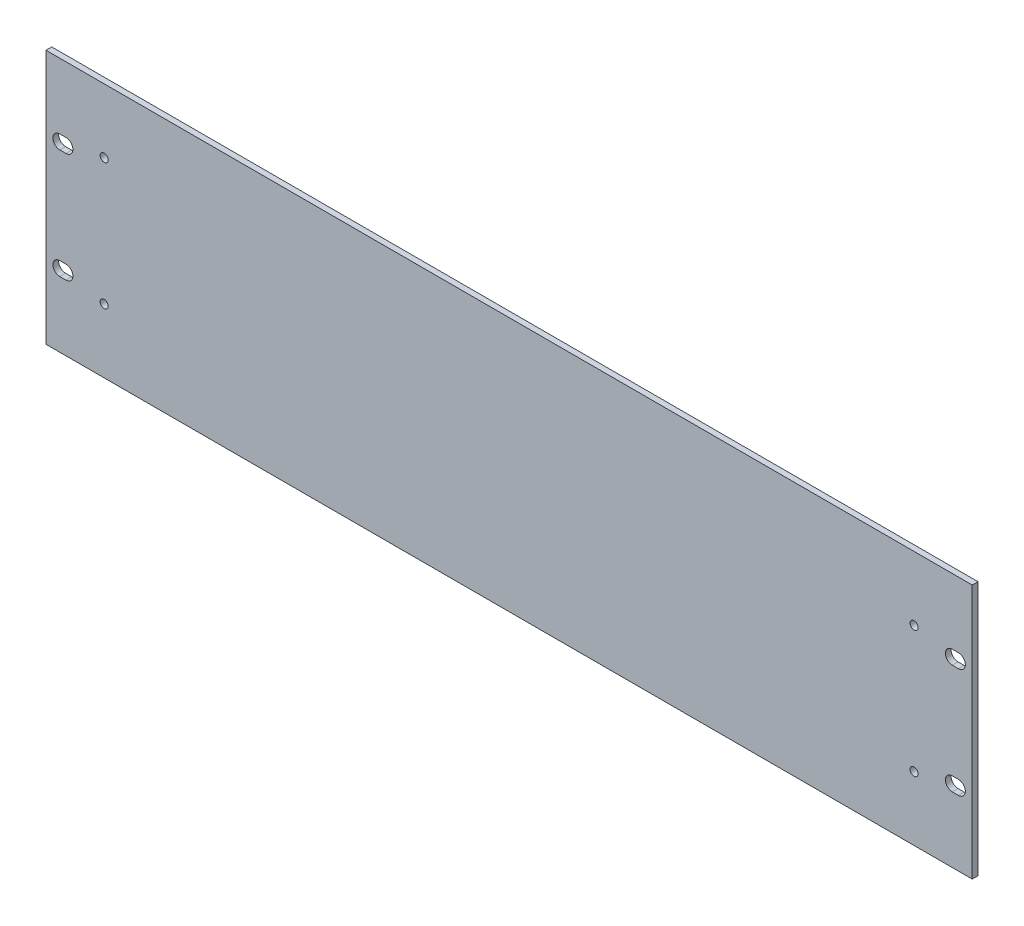
ISO-10303-21;
HEADER;
FILE_DESCRIPTION(('STEP AP214'),'2;1');
FILE_NAME('part.step','',(''),(''),'','','');
FILE_SCHEMA(('AUTOMOTIVE_DESIGN { 1 0 10303 214 1 1 1 1 }'));
ENDSEC;
DATA;
#1=APPLICATION_CONTEXT('core data for automotive mechanical design processes');
#2=APPLICATION_PROTOCOL_DEFINITION('international standard','automotive_design',2000,#1);
#3=PRODUCT_CONTEXT('',#1,'mechanical');
#4=PRODUCT('Part','Part','',(#3));
#5=PRODUCT_RELATED_PRODUCT_CATEGORY('part','',(#4));
#6=PRODUCT_DEFINITION_FORMATION('','',#4);
#7=PRODUCT_DEFINITION_CONTEXT('part definition',#1,'design');
#8=PRODUCT_DEFINITION('design','',#6,#7);
#9=PRODUCT_DEFINITION_SHAPE('','',#8);
#10=(LENGTH_UNIT() NAMED_UNIT(*) SI_UNIT(.MILLI.,.METRE.));
#11=(NAMED_UNIT(*) PLANE_ANGLE_UNIT() SI_UNIT($,.RADIAN.));
#12=(NAMED_UNIT(*) SI_UNIT($,.STERADIAN.) SOLID_ANGLE_UNIT());
#13=UNCERTAINTY_MEASURE_WITH_UNIT(LENGTH_MEASURE(1.E-05),#10,'distance_accuracy_value','');
#14=(GEOMETRIC_REPRESENTATION_CONTEXT(3) GLOBAL_UNCERTAINTY_ASSIGNED_CONTEXT((#13)) GLOBAL_UNIT_ASSIGNED_CONTEXT((#10,
#11,#12)) REPRESENTATION_CONTEXT('',''));
#15=CARTESIAN_POINT('',(0.,0.,0.));
#16=DIRECTION('',(0.,0.,1.));
#17=DIRECTION('',(1.,0.,0.));
#18=AXIS2_PLACEMENT_3D('',#15,#16,#17);
#19=CARTESIAN_POINT('',(0.,66.35,3.));
#20=DIRECTION('',(0.,0.,-1.));
#21=DIRECTION('',(-1.,0.,0.));
#22=AXIS2_PLACEMENT_3D('',#19,#20,#21);
#23=PLANE('',#22);
#24=CARTESIAN_POINT('',(211.,33.,3.));
#25=DIRECTION('',(0.,0.,1.));
#26=DIRECTION('',(1.,0.,0.));
#27=AXIS2_PLACEMENT_3D('',#24,#25,#26);
#28=CIRCLE('',#27,2.09999999999999);
#29=CARTESIAN_POINT('',(213.1,33.,3.));
#30=VERTEX_POINT('',#29);
#31=EDGE_CURVE('E343',#30,#30,#28,.T.);
#32=ORIENTED_EDGE('',*,*,#31,.F.);
#33=EDGE_LOOP('',(#32));
#34=FACE_BOUND('',#33,.T.);
#35=DIRECTION('',(-1.,0.,0.));
#36=VECTOR('',#35,1.);
#37=CARTESIAN_POINT('',(0.,66.35,3.));
#38=LINE('',#37,#36);
#39=CARTESIAN_POINT('',(241.3,66.35,3.));
#40=VERTEX_POINT('',#39);
#41=CARTESIAN_POINT('',(-241.3,66.35,3.));
#42=VERTEX_POINT('',#41);
#43=EDGE_CURVE('E44',#40,#42,#38,.T.);
#44=ORIENTED_EDGE('',*,*,#43,.T.);
#45=DIRECTION('',(0.,1.,0.));
#46=VECTOR('',#45,1.);
#47=CARTESIAN_POINT('',(-241.3,0.,3.));
#48=LINE('',#47,#46);
#49=CARTESIAN_POINT('',(-241.3,-66.35,3.));
#50=VERTEX_POINT('',#49);
#51=EDGE_CURVE('E264',#50,#42,#48,.T.);
#52=ORIENTED_EDGE('',*,*,#51,.F.);
#53=DIRECTION('',(-1.,0.,0.));
#54=VECTOR('',#53,1.);
#55=CARTESIAN_POINT('',(0.,-66.35,3.));
#56=LINE('',#55,#54);
#57=CARTESIAN_POINT('',(241.3,-66.35,3.));
#58=VERTEX_POINT('',#57);
#59=EDGE_CURVE('E311',#58,#50,#56,.T.);
#60=ORIENTED_EDGE('',*,*,#59,.F.);
#61=DIRECTION('',(0.,1.,0.));
#62=VECTOR('',#61,1.);
#63=CARTESIAN_POINT('',(241.3,0.,3.));
#64=LINE('',#63,#62);
#65=EDGE_CURVE('E349',#58,#40,#64,.T.);
#66=ORIENTED_EDGE('',*,*,#65,.T.);
#67=EDGE_LOOP('',(#44,#52,#60,#66));
#68=FACE_BOUND('',#67,.T.);
#69=CARTESIAN_POINT('',(230.9,28.575,3.));
#70=DIRECTION('',(0.,0.,1.));
#71=DIRECTION('',(1.,0.,0.));
#72=AXIS2_PLACEMENT_3D('',#69,#70,#71);
#73=CIRCLE('',#72,3.60000000000002);
#74=CARTESIAN_POINT('',(230.9,32.175,3.));
#75=VERTEX_POINT('',#74);
#76=CARTESIAN_POINT('',(230.9,24.975,3.));
#77=VERTEX_POINT('',#76);
#78=EDGE_CURVE('E317',#75,#77,#73,.T.);
#79=ORIENTED_EDGE('',*,*,#78,.F.);
#80=DIRECTION('',(-1.,0.,0.));
#81=VECTOR('',#80,1.);
#82=CARTESIAN_POINT('',(230.9,32.175,3.));
#83=LINE('',#82,#81);
#84=CARTESIAN_POINT('',(234.1,32.175,3.));
#85=VERTEX_POINT('',#84);
#86=EDGE_CURVE('E324',#85,#75,#83,.T.);
#87=ORIENTED_EDGE('',*,*,#86,.F.);
#88=CARTESIAN_POINT('',(234.1,28.575,3.));
#89=DIRECTION('',(0.,0.,1.));
#90=DIRECTION('',(1.,0.,0.));
#91=AXIS2_PLACEMENT_3D('',#88,#89,#90);
#92=CIRCLE('',#91,3.60000000000002);
#93=CARTESIAN_POINT('',(234.1,24.975,3.));
#94=VERTEX_POINT('',#93);
#95=EDGE_CURVE('E322',#94,#85,#92,.T.);
#96=ORIENTED_EDGE('',*,*,#95,.F.);
#97=DIRECTION('',(1.,0.,0.));
#98=VECTOR('',#97,1.);
#99=CARTESIAN_POINT('',(230.9,24.975,3.));
#100=LINE('',#99,#98);
#101=EDGE_CURVE('E319',#77,#94,#100,.T.);
#102=ORIENTED_EDGE('',*,*,#101,.F.);
#103=EDGE_LOOP('',(#79,#87,#96,#102));
#104=FACE_BOUND('',#103,.T.);
#105=CARTESIAN_POINT('',(211.,-33.,3.));
#106=DIRECTION('',(0.,0.,-1.));
#107=DIRECTION('',(1.,0.,0.));
#108=AXIS2_PLACEMENT_3D('',#105,#106,#107);
#109=CIRCLE('',#108,2.09999999999999);
#110=CARTESIAN_POINT('',(213.1,-33.,3.));
#111=VERTEX_POINT('',#110);
#112=EDGE_CURVE('E305',#111,#111,#109,.T.);
#113=ORIENTED_EDGE('',*,*,#112,.T.);
#114=EDGE_LOOP('',(#113));
#115=FACE_BOUND('',#114,.T.);
#116=CARTESIAN_POINT('',(230.9,-28.575,3.));
#117=DIRECTION('',(0.,0.,-1.));
#118=DIRECTION('',(1.,0.,0.));
#119=AXIS2_PLACEMENT_3D('',#116,#117,#118);
#120=CIRCLE('',#119,3.60000000000002);
#121=CARTESIAN_POINT('',(230.9,-32.175,3.));
#122=VERTEX_POINT('',#121);
#123=CARTESIAN_POINT('',(230.9,-24.975,3.));
#124=VERTEX_POINT('',#123);
#125=EDGE_CURVE('E273',#122,#124,#120,.T.);
#126=ORIENTED_EDGE('',*,*,#125,.T.);
#127=DIRECTION('',(1.,0.,0.));
#128=VECTOR('',#127,1.);
#129=CARTESIAN_POINT('',(230.9,-24.975,3.));
#130=LINE('',#129,#128);
#131=CARTESIAN_POINT('',(234.1,-24.975,3.));
#132=VERTEX_POINT('',#131);
#133=EDGE_CURVE('E276',#124,#132,#130,.T.);
#134=ORIENTED_EDGE('',*,*,#133,.T.);
#135=CARTESIAN_POINT('',(234.1,-28.575,3.));
#136=DIRECTION('',(0.,0.,-1.));
#137=DIRECTION('',(1.,0.,0.));
#138=AXIS2_PLACEMENT_3D('',#135,#136,#137);
#139=CIRCLE('',#138,3.60000000000002);
#140=CARTESIAN_POINT('',(234.1,-32.175,3.));
#141=VERTEX_POINT('',#140);
#142=EDGE_CURVE('E280',#132,#141,#139,.T.);
#143=ORIENTED_EDGE('',*,*,#142,.T.);
#144=DIRECTION('',(-1.,0.,0.));
#145=VECTOR('',#144,1.);
#146=CARTESIAN_POINT('',(230.9,-32.175,3.));
#147=LINE('',#146,#145);
#148=EDGE_CURVE('E283',#141,#122,#147,.T.);
#149=ORIENTED_EDGE('',*,*,#148,.T.);
#150=EDGE_LOOP('',(#126,#134,#143,#149));
#151=FACE_BOUND('',#150,.T.);
#152=CARTESIAN_POINT('',(-211.,33.,3.));
#153=DIRECTION('',(0.,0.,-1.));
#154=DIRECTION('',(-1.,0.,0.));
#155=AXIS2_PLACEMENT_3D('',#152,#153,#154);
#156=CIRCLE('',#155,2.09999999999999);
#157=CARTESIAN_POINT('',(-213.1,33.,3.));
#158=VERTEX_POINT('',#157);
#159=EDGE_CURVE('E258',#158,#158,#156,.T.);
#160=ORIENTED_EDGE('',*,*,#159,.T.);
#161=EDGE_LOOP('',(#160));
#162=FACE_BOUND('',#161,.T.);
#163=CARTESIAN_POINT('',(-230.9,28.575,3.));
#164=DIRECTION('',(0.,0.,-1.));
#165=DIRECTION('',(-1.,0.,0.));
#166=AXIS2_PLACEMENT_3D('',#163,#164,#165);
#167=CIRCLE('',#166,3.60000000000002);
#168=CARTESIAN_POINT('',(-230.9,32.175,3.));
#169=VERTEX_POINT('',#168);
#170=CARTESIAN_POINT('',(-230.9,24.975,3.));
#171=VERTEX_POINT('',#170);
#172=EDGE_CURVE('E226',#169,#171,#167,.T.);
#173=ORIENTED_EDGE('',*,*,#172,.T.);
#174=DIRECTION('',(-1.,0.,0.));
#175=VECTOR('',#174,1.);
#176=CARTESIAN_POINT('',(-230.9,24.975,3.));
#177=LINE('',#176,#175);
#178=CARTESIAN_POINT('',(-234.1,24.975,3.));
#179=VERTEX_POINT('',#178);
#180=EDGE_CURVE('E229',#171,#179,#177,.T.);
#181=ORIENTED_EDGE('',*,*,#180,.T.);
#182=CARTESIAN_POINT('',(-234.1,28.575,3.));
#183=DIRECTION('',(0.,0.,-1.));
#184=DIRECTION('',(-1.,0.,0.));
#185=AXIS2_PLACEMENT_3D('',#182,#183,#184);
#186=CIRCLE('',#185,3.60000000000002);
#187=CARTESIAN_POINT('',(-234.1,32.175,3.));
#188=VERTEX_POINT('',#187);
#189=EDGE_CURVE('E233',#179,#188,#186,.T.);
#190=ORIENTED_EDGE('',*,*,#189,.T.);
#191=DIRECTION('',(1.,0.,0.));
#192=VECTOR('',#191,1.);
#193=CARTESIAN_POINT('',(-230.9,32.175,3.));
#194=LINE('',#193,#192);
#195=EDGE_CURVE('E236',#188,#169,#194,.T.);
#196=ORIENTED_EDGE('',*,*,#195,.T.);
#197=EDGE_LOOP('',(#173,#181,#190,#196));
#198=FACE_BOUND('',#197,.T.);
#199=CARTESIAN_POINT('',(-211.,-33.,3.));
#200=DIRECTION('',(0.,0.,1.));
#201=DIRECTION('',(-1.,0.,0.));
#202=AXIS2_PLACEMENT_3D('',#199,#200,#201);
#203=CIRCLE('',#202,2.09999999999999);
#204=CARTESIAN_POINT('',(-213.1,-33.,3.));
#205=VERTEX_POINT('',#204);
#206=EDGE_CURVE('E217',#205,#205,#203,.T.);
#207=ORIENTED_EDGE('',*,*,#206,.F.);
#208=EDGE_LOOP('',(#207));
#209=FACE_BOUND('',#208,.T.);
#210=CARTESIAN_POINT('',(-230.9,-28.575,3.));
#211=DIRECTION('',(0.,0.,1.));
#212=DIRECTION('',(-1.,0.,0.));
#213=AXIS2_PLACEMENT_3D('',#210,#211,#212);
#214=CIRCLE('',#213,3.60000000000002);
#215=CARTESIAN_POINT('',(-230.9,-32.175,3.));
#216=VERTEX_POINT('',#215);
#217=CARTESIAN_POINT('',(-230.9,-24.975,3.));
#218=VERTEX_POINT('',#217);
#219=EDGE_CURVE('E192',#216,#218,#214,.T.);
#220=ORIENTED_EDGE('',*,*,#219,.F.);
#221=DIRECTION('',(1.,0.,0.));
#222=VECTOR('',#221,1.);
#223=CARTESIAN_POINT('',(-230.9,-32.175,3.));
#224=LINE('',#223,#222);
#225=CARTESIAN_POINT('',(-234.1,-32.175,3.));
#226=VERTEX_POINT('',#225);
#227=EDGE_CURVE('E206',#226,#216,#224,.T.);
#228=ORIENTED_EDGE('',*,*,#227,.F.);
#229=CARTESIAN_POINT('',(-234.1,-28.575,3.));
#230=DIRECTION('',(0.,0.,1.));
#231=DIRECTION('',(-1.,0.,0.));
#232=AXIS2_PLACEMENT_3D('',#229,#230,#231);
#233=CIRCLE('',#232,3.60000000000002);
#234=CARTESIAN_POINT('',(-234.1,-24.975,3.));
#235=VERTEX_POINT('',#234);
#236=EDGE_CURVE('E194',#235,#226,#233,.T.);
#237=ORIENTED_EDGE('',*,*,#236,.F.);
#238=DIRECTION('',(-1.,0.,0.));
#239=VECTOR('',#238,1.);
#240=CARTESIAN_POINT('',(-230.9,-24.975,3.));
#241=LINE('',#240,#239);
#242=EDGE_CURVE('E178',#218,#235,#241,.T.);
#243=ORIENTED_EDGE('',*,*,#242,.F.);
#244=EDGE_LOOP('',(#220,#228,#237,#243));
#245=FACE_BOUND('',#244,.T.);
#246=ADVANCED_FACE('F36',(#34,#68,#104,#115,#151,#162,#198,#209,#245),#23,.F.);
#247=CARTESIAN_POINT('',(0.,66.35,0.));
#248=DIRECTION('',(0.,0.,-1.));
#249=DIRECTION('',(-1.,0.,0.));
#250=AXIS2_PLACEMENT_3D('',#247,#248,#249);
#251=PLANE('',#250);
#252=DIRECTION('',(-1.,0.,0.));
#253=VECTOR('',#252,1.);
#254=CARTESIAN_POINT('',(0.,-66.35,0.));
#255=LINE('',#254,#253);
#256=CARTESIAN_POINT('',(241.3,-66.35,0.));
#257=VERTEX_POINT('',#256);
#258=CARTESIAN_POINT('',(-241.3,-66.35,0.));
#259=VERTEX_POINT('',#258);
#260=EDGE_CURVE('E308',#257,#259,#255,.T.);
#261=ORIENTED_EDGE('',*,*,#260,.T.);
#262=DIRECTION('',(0.,1.,0.));
#263=VECTOR('',#262,1.);
#264=CARTESIAN_POINT('',(-241.3,0.,0.));
#265=LINE('',#264,#263);
#266=CARTESIAN_POINT('',(-241.3,66.35,0.));
#267=VERTEX_POINT('',#266);
#268=EDGE_CURVE('E261',#259,#267,#265,.T.);
#269=ORIENTED_EDGE('',*,*,#268,.T.);
#270=DIRECTION('',(-1.,0.,0.));
#271=VECTOR('',#270,1.);
#272=CARTESIAN_POINT('',(0.,66.35,0.));
#273=LINE('',#272,#271);
#274=CARTESIAN_POINT('',(241.3,66.35,0.));
#275=VERTEX_POINT('',#274);
#276=EDGE_CURVE('E351',#275,#267,#273,.T.);
#277=ORIENTED_EDGE('',*,*,#276,.F.);
#278=DIRECTION('',(0.,1.,0.));
#279=VECTOR('',#278,1.);
#280=CARTESIAN_POINT('',(241.3,0.,0.));
#281=LINE('',#280,#279);
#282=EDGE_CURVE('E346',#257,#275,#281,.T.);
#283=ORIENTED_EDGE('',*,*,#282,.F.);
#284=EDGE_LOOP('',(#261,#269,#277,#283));
#285=FACE_BOUND('',#284,.T.);
#286=CARTESIAN_POINT('',(211.,33.,0.));
#287=DIRECTION('',(0.,0.,1.));
#288=DIRECTION('',(1.,0.,0.));
#289=AXIS2_PLACEMENT_3D('',#286,#287,#288);
#290=CIRCLE('',#289,2.09999999999999);
#291=CARTESIAN_POINT('',(213.1,33.,0.));
#292=VERTEX_POINT('',#291);
#293=EDGE_CURVE('E342',#292,#292,#290,.T.);
#294=ORIENTED_EDGE('',*,*,#293,.T.);
#295=EDGE_LOOP('',(#294));
#296=FACE_BOUND('',#295,.T.);
#297=DIRECTION('',(-1.,0.,0.));
#298=VECTOR('',#297,1.);
#299=CARTESIAN_POINT('',(230.9,32.175,0.));
#300=LINE('',#299,#298);
#301=CARTESIAN_POINT('',(234.1,32.175,0.));
#302=VERTEX_POINT('',#301);
#303=CARTESIAN_POINT('',(230.9,32.175,0.));
#304=VERTEX_POINT('',#303);
#305=EDGE_CURVE('E320',#302,#304,#300,.T.);
#306=ORIENTED_EDGE('',*,*,#305,.T.);
#307=CARTESIAN_POINT('',(230.9,28.575,0.));
#308=DIRECTION('',(0.,0.,1.));
#309=DIRECTION('',(1.,0.,0.));
#310=AXIS2_PLACEMENT_3D('',#307,#308,#309);
#311=CIRCLE('',#310,3.60000000000002);
#312=CARTESIAN_POINT('',(230.9,24.975,0.));
#313=VERTEX_POINT('',#312);
#314=EDGE_CURVE('E59',#304,#313,#311,.T.);
#315=ORIENTED_EDGE('',*,*,#314,.T.);
#316=DIRECTION('',(1.,0.,0.));
#317=VECTOR('',#316,1.);
#318=CARTESIAN_POINT('',(230.9,24.975,0.));
#319=LINE('',#318,#317);
#320=CARTESIAN_POINT('',(234.1,24.975,0.));
#321=VERTEX_POINT('',#320);
#322=EDGE_CURVE('E328',#313,#321,#319,.T.);
#323=ORIENTED_EDGE('',*,*,#322,.T.);
#324=CARTESIAN_POINT('',(234.1,28.575,0.));
#325=DIRECTION('',(0.,0.,1.));
#326=DIRECTION('',(1.,0.,0.));
#327=AXIS2_PLACEMENT_3D('',#324,#325,#326);
#328=CIRCLE('',#327,3.60000000000002);
#329=EDGE_CURVE('E331',#321,#302,#328,.T.);
#330=ORIENTED_EDGE('',*,*,#329,.T.);
#331=EDGE_LOOP('',(#306,#315,#323,#330));
#332=FACE_BOUND('',#331,.T.);
#333=CARTESIAN_POINT('',(211.,-33.,0.));
#334=DIRECTION('',(0.,0.,-1.));
#335=DIRECTION('',(1.,0.,0.));
#336=AXIS2_PLACEMENT_3D('',#333,#334,#335);
#337=CIRCLE('',#336,2.09999999999999);
#338=CARTESIAN_POINT('',(213.1,-33.,0.));
#339=VERTEX_POINT('',#338);
#340=EDGE_CURVE('E304',#339,#339,#337,.T.);
#341=ORIENTED_EDGE('',*,*,#340,.F.);
#342=EDGE_LOOP('',(#341));
#343=FACE_BOUND('',#342,.T.);
#344=DIRECTION('',(-1.,0.,0.));
#345=VECTOR('',#344,1.);
#346=CARTESIAN_POINT('',(230.9,-32.175,0.));
#347=LINE('',#346,#345);
#348=CARTESIAN_POINT('',(234.1,-32.175,0.));
#349=VERTEX_POINT('',#348);
#350=CARTESIAN_POINT('',(230.9,-32.175,0.));
#351=VERTEX_POINT('',#350);
#352=EDGE_CURVE('E277',#349,#351,#347,.T.);
#353=ORIENTED_EDGE('',*,*,#352,.F.);
#354=CARTESIAN_POINT('',(234.1,-28.575,0.));
#355=DIRECTION('',(0.,0.,-1.));
#356=DIRECTION('',(1.,0.,0.));
#357=AXIS2_PLACEMENT_3D('',#354,#355,#356);
#358=CIRCLE('',#357,3.60000000000002);
#359=CARTESIAN_POINT('',(234.1,-24.975,0.));
#360=VERTEX_POINT('',#359);
#361=EDGE_CURVE('E292',#360,#349,#358,.T.);
#362=ORIENTED_EDGE('',*,*,#361,.F.);
#363=DIRECTION('',(1.,0.,0.));
#364=VECTOR('',#363,1.);
#365=CARTESIAN_POINT('',(230.9,-24.975,0.));
#366=LINE('',#365,#364);
#367=CARTESIAN_POINT('',(230.9,-24.975,0.));
#368=VERTEX_POINT('',#367);
#369=EDGE_CURVE('E289',#368,#360,#366,.T.);
#370=ORIENTED_EDGE('',*,*,#369,.F.);
#371=CARTESIAN_POINT('',(230.9,-28.575,0.));
#372=DIRECTION('',(0.,0.,-1.));
#373=DIRECTION('',(1.,0.,0.));
#374=AXIS2_PLACEMENT_3D('',#371,#372,#373);
#375=CIRCLE('',#374,3.60000000000002);
#376=EDGE_CURVE('E272',#351,#368,#375,.T.);
#377=ORIENTED_EDGE('',*,*,#376,.F.);
#378=EDGE_LOOP('',(#353,#362,#370,#377));
#379=FACE_BOUND('',#378,.T.);
#380=CARTESIAN_POINT('',(-211.,33.,0.));
#381=DIRECTION('',(0.,0.,-1.));
#382=DIRECTION('',(-1.,0.,0.));
#383=AXIS2_PLACEMENT_3D('',#380,#381,#382);
#384=CIRCLE('',#383,2.09999999999999);
#385=CARTESIAN_POINT('',(-213.1,33.,0.));
#386=VERTEX_POINT('',#385);
#387=EDGE_CURVE('E257',#386,#386,#384,.T.);
#388=ORIENTED_EDGE('',*,*,#387,.F.);
#389=EDGE_LOOP('',(#388));
#390=FACE_BOUND('',#389,.T.);
#391=DIRECTION('',(1.,0.,0.));
#392=VECTOR('',#391,1.);
#393=CARTESIAN_POINT('',(-230.9,32.175,0.));
#394=LINE('',#393,#392);
#395=CARTESIAN_POINT('',(-234.1,32.175,0.));
#396=VERTEX_POINT('',#395);
#397=CARTESIAN_POINT('',(-230.9,32.175,0.));
#398=VERTEX_POINT('',#397);
#399=EDGE_CURVE('E230',#396,#398,#394,.T.);
#400=ORIENTED_EDGE('',*,*,#399,.F.);
#401=CARTESIAN_POINT('',(-234.1,28.575,0.));
#402=DIRECTION('',(0.,0.,-1.));
#403=DIRECTION('',(-1.,0.,0.));
#404=AXIS2_PLACEMENT_3D('',#401,#402,#403);
#405=CIRCLE('',#404,3.60000000000002);
#406=CARTESIAN_POINT('',(-234.1,24.975,0.));
#407=VERTEX_POINT('',#406);
#408=EDGE_CURVE('E245',#407,#396,#405,.T.);
#409=ORIENTED_EDGE('',*,*,#408,.F.);
#410=DIRECTION('',(-1.,0.,0.));
#411=VECTOR('',#410,1.);
#412=CARTESIAN_POINT('',(-230.9,24.975,0.));
#413=LINE('',#412,#411);
#414=CARTESIAN_POINT('',(-230.9,24.975,0.));
#415=VERTEX_POINT('',#414);
#416=EDGE_CURVE('E242',#415,#407,#413,.T.);
#417=ORIENTED_EDGE('',*,*,#416,.F.);
#418=CARTESIAN_POINT('',(-230.9,28.575,0.));
#419=DIRECTION('',(0.,0.,-1.));
#420=DIRECTION('',(-1.,0.,0.));
#421=AXIS2_PLACEMENT_3D('',#418,#419,#420);
#422=CIRCLE('',#421,3.60000000000002);
#423=EDGE_CURVE('E225',#398,#415,#422,.T.);
#424=ORIENTED_EDGE('',*,*,#423,.F.);
#425=EDGE_LOOP('',(#400,#409,#417,#424));
#426=FACE_BOUND('',#425,.T.);
#427=CARTESIAN_POINT('',(-211.,-33.,0.));
#428=DIRECTION('',(0.,0.,1.));
#429=DIRECTION('',(-1.,0.,0.));
#430=AXIS2_PLACEMENT_3D('',#427,#428,#429);
#431=CIRCLE('',#430,2.09999999999999);
#432=CARTESIAN_POINT('',(-213.1,-33.,0.));
#433=VERTEX_POINT('',#432);
#434=EDGE_CURVE('E186',#433,#433,#431,.T.);
#435=ORIENTED_EDGE('',*,*,#434,.T.);
#436=EDGE_LOOP('',(#435));
#437=FACE_BOUND('',#436,.T.);
#438=DIRECTION('',(1.,0.,0.));
#439=VECTOR('',#438,1.);
#440=CARTESIAN_POINT('',(-230.9,-32.175,0.));
#441=LINE('',#440,#439);
#442=CARTESIAN_POINT('',(-234.1,-32.175,0.));
#443=VERTEX_POINT('',#442);
#444=CARTESIAN_POINT('',(-230.9,-32.175,0.));
#445=VERTEX_POINT('',#444);
#446=EDGE_CURVE('E199',#443,#445,#441,.T.);
#447=ORIENTED_EDGE('',*,*,#446,.T.);
#448=CARTESIAN_POINT('',(-230.9,-28.575,0.));
#449=DIRECTION('',(0.,0.,1.));
#450=DIRECTION('',(-1.,0.,0.));
#451=AXIS2_PLACEMENT_3D('',#448,#449,#450);
#452=CIRCLE('',#451,3.60000000000002);
#453=CARTESIAN_POINT('',(-230.9,-24.975,0.));
#454=VERTEX_POINT('',#453);
#455=EDGE_CURVE('E208',#445,#454,#452,.T.);
#456=ORIENTED_EDGE('',*,*,#455,.T.);
#457=DIRECTION('',(-1.,0.,0.));
#458=VECTOR('',#457,1.);
#459=CARTESIAN_POINT('',(-230.9,-24.975,0.));
#460=LINE('',#459,#458);
#461=CARTESIAN_POINT('',(-234.1,-24.975,0.));
#462=VERTEX_POINT('',#461);
#463=EDGE_CURVE('E181',#454,#462,#460,.T.);
#464=ORIENTED_EDGE('',*,*,#463,.T.);
#465=CARTESIAN_POINT('',(-234.1,-28.575,0.));
#466=DIRECTION('',(0.,0.,1.));
#467=DIRECTION('',(-1.,0.,0.));
#468=AXIS2_PLACEMENT_3D('',#465,#466,#467);
#469=CIRCLE('',#468,3.60000000000002);
#470=EDGE_CURVE('E202',#462,#443,#469,.T.);
#471=ORIENTED_EDGE('',*,*,#470,.T.);
#472=EDGE_LOOP('',(#447,#456,#464,#471));
#473=FACE_BOUND('',#472,.T.);
#474=ADVANCED_FACE('F365',(#285,#296,#332,#343,#379,#390,#426,#437,#473),#251,.T.);
#475=CARTESIAN_POINT('',(241.3,0.,3.));
#476=DIRECTION('',(-1.,0.,0.));
#477=DIRECTION('',(0.,-1.,0.));
#478=AXIS2_PLACEMENT_3D('',#475,#476,#477);
#479=PLANE('',#478);
#480=ORIENTED_EDGE('',*,*,#282,.T.);
#481=DIRECTION('',(0.,0.,-1.));
#482=VECTOR('',#481,1.);
#483=CARTESIAN_POINT('',(241.3,66.35,3.));
#484=LINE('',#483,#482);
#485=EDGE_CURVE('E11',#40,#275,#484,.T.);
#486=ORIENTED_EDGE('',*,*,#485,.F.);
#487=ORIENTED_EDGE('',*,*,#65,.F.);
#488=DIRECTION('',(0.,0.,-1.));
#489=VECTOR('',#488,1.);
#490=CARTESIAN_POINT('',(241.3,-66.35,3.));
#491=LINE('',#490,#489);
#492=EDGE_CURVE('E313',#58,#257,#491,.T.);
#493=ORIENTED_EDGE('',*,*,#492,.T.);
#494=EDGE_LOOP('',(#480,#486,#487,#493));
#495=FACE_BOUND('',#494,.T.);
#496=ADVANCED_FACE('F38',(#495),#479,.F.);
#497=CARTESIAN_POINT('',(0.,66.35,3.));
#498=DIRECTION('',(0.,-1.,0.));
#499=DIRECTION('',(0.,0.,-1.));
#500=AXIS2_PLACEMENT_3D('',#497,#498,#499);
#501=PLANE('',#500);
#502=ORIENTED_EDGE('',*,*,#276,.T.);
#503=DIRECTION('',(0.,0.,-1.));
#504=VECTOR('',#503,1.);
#505=CARTESIAN_POINT('',(-241.3,66.35,3.));
#506=LINE('',#505,#504);
#507=EDGE_CURVE('E267',#42,#267,#506,.T.);
#508=ORIENTED_EDGE('',*,*,#507,.F.);
#509=ORIENTED_EDGE('',*,*,#43,.F.);
#510=ORIENTED_EDGE('',*,*,#485,.T.);
#511=EDGE_LOOP('',(#502,#508,#509,#510));
#512=FACE_BOUND('',#511,.T.);
#513=ADVANCED_FACE('F356',(#512),#501,.F.);
#514=CARTESIAN_POINT('',(211.,33.,3.));
#515=DIRECTION('',(0.,0.,-1.));
#516=DIRECTION('',(-1.,0.,0.));
#517=AXIS2_PLACEMENT_3D('',#514,#515,#516);
#518=CYLINDRICAL_SURFACE('',#517,2.09999999999999);
#519=ORIENTED_EDGE('',*,*,#31,.T.);
#520=EDGE_LOOP('',(#519));
#521=FACE_BOUND('',#520,.T.);
#522=ORIENTED_EDGE('',*,*,#293,.F.);
#523=EDGE_LOOP('',(#522));
#524=FACE_BOUND('',#523,.T.);
#525=ADVANCED_FACE('F380',(#521,#524),#518,.F.);
#526=CARTESIAN_POINT('',(230.9,28.575,3.));
#527=DIRECTION('',(0.,0.,-1.));
#528=DIRECTION('',(-1.,0.,0.));
#529=AXIS2_PLACEMENT_3D('',#526,#527,#528);
#530=CYLINDRICAL_SURFACE('',#529,3.60000000000002);
#531=ORIENTED_EDGE('',*,*,#314,.F.);
#532=DIRECTION('',(0.,0.,-1.));
#533=VECTOR('',#532,1.);
#534=CARTESIAN_POINT('',(230.9,32.175,3.));
#535=LINE('',#534,#533);
#536=EDGE_CURVE('E326',#75,#304,#535,.T.);
#537=ORIENTED_EDGE('',*,*,#536,.F.);
#538=ORIENTED_EDGE('',*,*,#78,.T.);
#539=DIRECTION('',(0.,0.,-1.));
#540=VECTOR('',#539,1.);
#541=CARTESIAN_POINT('',(230.9,24.975,3.));
#542=LINE('',#541,#540);
#543=EDGE_CURVE('E340',#77,#313,#542,.T.);
#544=ORIENTED_EDGE('',*,*,#543,.T.);
#545=EDGE_LOOP('',(#531,#537,#538,#544));
#546=FACE_BOUND('',#545,.T.);
#547=ADVANCED_FACE('F391',(#546),#530,.F.);
#548=CARTESIAN_POINT('',(230.9,24.975,3.));
#549=DIRECTION('',(0.,1.,0.));
#550=DIRECTION('',(0.,0.,1.));
#551=AXIS2_PLACEMENT_3D('',#548,#549,#550);
#552=PLANE('',#551);
#553=ORIENTED_EDGE('',*,*,#322,.F.);
#554=ORIENTED_EDGE('',*,*,#543,.F.);
#555=ORIENTED_EDGE('',*,*,#101,.T.);
#556=DIRECTION('',(0.,0.,-1.));
#557=VECTOR('',#556,1.);
#558=CARTESIAN_POINT('',(234.1,24.975,3.));
#559=LINE('',#558,#557);
#560=EDGE_CURVE('E338',#94,#321,#559,.T.);
#561=ORIENTED_EDGE('',*,*,#560,.T.);
#562=EDGE_LOOP('',(#553,#554,#555,#561));
#563=FACE_BOUND('',#562,.T.);
#564=ADVANCED_FACE('F395',(#563),#552,.T.);
#565=CARTESIAN_POINT('',(234.1,28.575,3.));
#566=DIRECTION('',(0.,0.,-1.));
#567=DIRECTION('',(-1.,0.,0.));
#568=AXIS2_PLACEMENT_3D('',#565,#566,#567);
#569=CYLINDRICAL_SURFACE('',#568,3.60000000000002);
#570=ORIENTED_EDGE('',*,*,#329,.F.);
#571=ORIENTED_EDGE('',*,*,#560,.F.);
#572=ORIENTED_EDGE('',*,*,#95,.T.);
#573=DIRECTION('',(0.,0.,-1.));
#574=VECTOR('',#573,1.);
#575=CARTESIAN_POINT('',(234.1,32.175,3.));
#576=LINE('',#575,#574);
#577=EDGE_CURVE('E51',#85,#302,#576,.T.);
#578=ORIENTED_EDGE('',*,*,#577,.T.);
#579=EDGE_LOOP('',(#570,#571,#572,#578));
#580=FACE_BOUND('',#579,.T.);
#581=ADVANCED_FACE('F398',(#580),#569,.F.);
#582=CARTESIAN_POINT('',(230.9,32.175,3.));
#583=DIRECTION('',(0.,-1.,0.));
#584=DIRECTION('',(0.,0.,-1.));
#585=AXIS2_PLACEMENT_3D('',#582,#583,#584);
#586=PLANE('',#585);
#587=ORIENTED_EDGE('',*,*,#305,.F.);
#588=ORIENTED_EDGE('',*,*,#577,.F.);
#589=ORIENTED_EDGE('',*,*,#86,.T.);
#590=ORIENTED_EDGE('',*,*,#536,.T.);
#591=EDGE_LOOP('',(#587,#588,#589,#590));
#592=FACE_BOUND('',#591,.T.);
#593=ADVANCED_FACE('F402',(#592),#586,.T.);
#594=CARTESIAN_POINT('',(0.,-66.35,3.));
#595=DIRECTION('',(0.,1.,0.));
#596=DIRECTION('',(0.,0.,-1.));
#597=AXIS2_PLACEMENT_3D('',#594,#595,#596);
#598=PLANE('',#597);
#599=ORIENTED_EDGE('',*,*,#260,.F.);
#600=ORIENTED_EDGE('',*,*,#492,.F.);
#601=ORIENTED_EDGE('',*,*,#59,.T.);
#602=DIRECTION('',(0.,0.,-1.));
#603=VECTOR('',#602,1.);
#604=CARTESIAN_POINT('',(-241.3,-66.35,3.));
#605=LINE('',#604,#603);
#606=EDGE_CURVE('E220',#50,#259,#605,.T.);
#607=ORIENTED_EDGE('',*,*,#606,.T.);
#608=EDGE_LOOP('',(#599,#600,#601,#607));
#609=FACE_BOUND('',#608,.T.);
#610=ADVANCED_FACE('F370',(#609),#598,.F.);
#611=CARTESIAN_POINT('',(211.,-33.,3.));
#612=DIRECTION('',(0.,0.,-1.));
#613=DIRECTION('',(-1.,0.,0.));
#614=AXIS2_PLACEMENT_3D('',#611,#612,#613);
#615=CYLINDRICAL_SURFACE('',#614,2.09999999999999);
#616=ORIENTED_EDGE('',*,*,#112,.F.);
#617=EDGE_LOOP('',(#616));
#618=FACE_BOUND('',#617,.T.);
#619=ORIENTED_EDGE('',*,*,#340,.T.);
#620=EDGE_LOOP('',(#619));
#621=FACE_BOUND('',#620,.T.);
#622=ADVANCED_FACE('F408',(#618,#621),#615,.F.);
#623=CARTESIAN_POINT('',(230.9,-28.575,3.));
#624=DIRECTION('',(0.,0.,-1.));
#625=DIRECTION('',(-1.,0.,0.));
#626=AXIS2_PLACEMENT_3D('',#623,#624,#625);
#627=CYLINDRICAL_SURFACE('',#626,3.60000000000002);
#628=ORIENTED_EDGE('',*,*,#376,.T.);
#629=DIRECTION('',(0.,0.,-1.));
#630=VECTOR('',#629,1.);
#631=CARTESIAN_POINT('',(230.9,-24.975,3.));
#632=LINE('',#631,#630);
#633=EDGE_CURVE('E302',#124,#368,#632,.T.);
#634=ORIENTED_EDGE('',*,*,#633,.F.);
#635=ORIENTED_EDGE('',*,*,#125,.F.);
#636=DIRECTION('',(0.,0.,-1.));
#637=VECTOR('',#636,1.);
#638=CARTESIAN_POINT('',(230.9,-32.175,3.));
#639=LINE('',#638,#637);
#640=EDGE_CURVE('E286',#122,#351,#639,.T.);
#641=ORIENTED_EDGE('',*,*,#640,.T.);
#642=EDGE_LOOP('',(#628,#634,#635,#641));
#643=FACE_BOUND('',#642,.T.);
#644=ADVANCED_FACE('F411',(#643),#627,.F.);
#645=CARTESIAN_POINT('',(230.9,-24.975,3.));
#646=DIRECTION('',(0.,-1.,0.));
#647=DIRECTION('',(0.,0.,1.));
#648=AXIS2_PLACEMENT_3D('',#645,#646,#647);
#649=PLANE('',#648);
#650=ORIENTED_EDGE('',*,*,#369,.T.);
#651=DIRECTION('',(0.,0.,-1.));
#652=VECTOR('',#651,1.);
#653=CARTESIAN_POINT('',(234.1,-24.975,3.));
#654=LINE('',#653,#652);
#655=EDGE_CURVE('E300',#132,#360,#654,.T.);
#656=ORIENTED_EDGE('',*,*,#655,.F.);
#657=ORIENTED_EDGE('',*,*,#133,.F.);
#658=ORIENTED_EDGE('',*,*,#633,.T.);
#659=EDGE_LOOP('',(#650,#656,#657,#658));
#660=FACE_BOUND('',#659,.T.);
#661=ADVANCED_FACE('F415',(#660),#649,.T.);
#662=CARTESIAN_POINT('',(234.1,-28.575,3.));
#663=DIRECTION('',(0.,0.,-1.));
#664=DIRECTION('',(-1.,0.,0.));
#665=AXIS2_PLACEMENT_3D('',#662,#663,#664);
#666=CYLINDRICAL_SURFACE('',#665,3.60000000000002);
#667=ORIENTED_EDGE('',*,*,#361,.T.);
#668=DIRECTION('',(0.,0.,-1.));
#669=VECTOR('',#668,1.);
#670=CARTESIAN_POINT('',(234.1,-32.175,3.));
#671=LINE('',#670,#669);
#672=EDGE_CURVE('E298',#141,#349,#671,.T.);
#673=ORIENTED_EDGE('',*,*,#672,.F.);
#674=ORIENTED_EDGE('',*,*,#142,.F.);
#675=ORIENTED_EDGE('',*,*,#655,.T.);
#676=EDGE_LOOP('',(#667,#673,#674,#675));
#677=FACE_BOUND('',#676,.T.);
#678=ADVANCED_FACE('F419',(#677),#666,.F.);
#679=CARTESIAN_POINT('',(230.9,-32.175,3.));
#680=DIRECTION('',(0.,1.,0.));
#681=DIRECTION('',(0.,0.,-1.));
#682=AXIS2_PLACEMENT_3D('',#679,#680,#681);
#683=PLANE('',#682);
#684=ORIENTED_EDGE('',*,*,#352,.T.);
#685=ORIENTED_EDGE('',*,*,#640,.F.);
#686=ORIENTED_EDGE('',*,*,#148,.F.);
#687=ORIENTED_EDGE('',*,*,#672,.T.);
#688=EDGE_LOOP('',(#684,#685,#686,#687));
#689=FACE_BOUND('',#688,.T.);
#690=ADVANCED_FACE('F423',(#689),#683,.T.);
#691=CARTESIAN_POINT('',(-241.3,0.,3.));
#692=DIRECTION('',(1.,0.,0.));
#693=DIRECTION('',(0.,-1.,0.));
#694=AXIS2_PLACEMENT_3D('',#691,#692,#693);
#695=PLANE('',#694);
#696=ORIENTED_EDGE('',*,*,#268,.F.);
#697=ORIENTED_EDGE('',*,*,#606,.F.);
#698=ORIENTED_EDGE('',*,*,#51,.T.);
#699=ORIENTED_EDGE('',*,*,#507,.T.);
#700=EDGE_LOOP('',(#696,#697,#698,#699));
#701=FACE_BOUND('',#700,.T.);
#702=ADVANCED_FACE('F362',(#701),#695,.F.);
#703=CARTESIAN_POINT('',(-211.,33.,3.));
#704=DIRECTION('',(0.,0.,-1.));
#705=DIRECTION('',(1.,0.,0.));
#706=AXIS2_PLACEMENT_3D('',#703,#704,#705);
#707=CYLINDRICAL_SURFACE('',#706,2.09999999999999);
#708=ORIENTED_EDGE('',*,*,#159,.F.);
#709=EDGE_LOOP('',(#708));
#710=FACE_BOUND('',#709,.T.);
#711=ORIENTED_EDGE('',*,*,#387,.T.);
#712=EDGE_LOOP('',(#711));
#713=FACE_BOUND('',#712,.T.);
#714=ADVANCED_FACE('F430',(#710,#713),#707,.F.);
#715=CARTESIAN_POINT('',(-230.9,28.575,3.));
#716=DIRECTION('',(0.,0.,-1.));
#717=DIRECTION('',(1.,0.,0.));
#718=AXIS2_PLACEMENT_3D('',#715,#716,#717);
#719=CYLINDRICAL_SURFACE('',#718,3.60000000000002);
#720=ORIENTED_EDGE('',*,*,#423,.T.);
#721=DIRECTION('',(0.,0.,-1.));
#722=VECTOR('',#721,1.);
#723=CARTESIAN_POINT('',(-230.9,24.975,3.));
#724=LINE('',#723,#722);
#725=EDGE_CURVE('E255',#171,#415,#724,.T.);
#726=ORIENTED_EDGE('',*,*,#725,.F.);
#727=ORIENTED_EDGE('',*,*,#172,.F.);
#728=DIRECTION('',(0.,0.,-1.));
#729=VECTOR('',#728,1.);
#730=CARTESIAN_POINT('',(-230.9,32.175,3.));
#731=LINE('',#730,#729);
#732=EDGE_CURVE('E239',#169,#398,#731,.T.);
#733=ORIENTED_EDGE('',*,*,#732,.T.);
#734=EDGE_LOOP('',(#720,#726,#727,#733));
#735=FACE_BOUND('',#734,.T.);
#736=ADVANCED_FACE('F433',(#735),#719,.F.);
#737=CARTESIAN_POINT('',(-230.9,24.975,3.));
#738=DIRECTION('',(0.,1.,0.));
#739=DIRECTION('',(0.,0.,1.));
#740=AXIS2_PLACEMENT_3D('',#737,#738,#739);
#741=PLANE('',#740);
#742=ORIENTED_EDGE('',*,*,#416,.T.);
#743=DIRECTION('',(0.,0.,-1.));
#744=VECTOR('',#743,1.);
#745=CARTESIAN_POINT('',(-234.1,24.975,3.));
#746=LINE('',#745,#744);
#747=EDGE_CURVE('E253',#179,#407,#746,.T.);
#748=ORIENTED_EDGE('',*,*,#747,.F.);
#749=ORIENTED_EDGE('',*,*,#180,.F.);
#750=ORIENTED_EDGE('',*,*,#725,.T.);
#751=EDGE_LOOP('',(#742,#748,#749,#750));
#752=FACE_BOUND('',#751,.T.);
#753=ADVANCED_FACE('F437',(#752),#741,.T.);
#754=CARTESIAN_POINT('',(-234.1,28.575,3.));
#755=DIRECTION('',(0.,0.,-1.));
#756=DIRECTION('',(1.,0.,0.));
#757=AXIS2_PLACEMENT_3D('',#754,#755,#756);
#758=CYLINDRICAL_SURFACE('',#757,3.60000000000002);
#759=ORIENTED_EDGE('',*,*,#408,.T.);
#760=DIRECTION('',(0.,0.,-1.));
#761=VECTOR('',#760,1.);
#762=CARTESIAN_POINT('',(-234.1,32.175,3.));
#763=LINE('',#762,#761);
#764=EDGE_CURVE('E251',#188,#396,#763,.T.);
#765=ORIENTED_EDGE('',*,*,#764,.F.);
#766=ORIENTED_EDGE('',*,*,#189,.F.);
#767=ORIENTED_EDGE('',*,*,#747,.T.);
#768=EDGE_LOOP('',(#759,#765,#766,#767));
#769=FACE_BOUND('',#768,.T.);
#770=ADVANCED_FACE('F441',(#769),#758,.F.);
#771=CARTESIAN_POINT('',(-230.9,32.175,3.));
#772=DIRECTION('',(0.,-1.,0.));
#773=DIRECTION('',(0.,0.,-1.));
#774=AXIS2_PLACEMENT_3D('',#771,#772,#773);
#775=PLANE('',#774);
#776=ORIENTED_EDGE('',*,*,#399,.T.);
#777=ORIENTED_EDGE('',*,*,#732,.F.);
#778=ORIENTED_EDGE('',*,*,#195,.F.);
#779=ORIENTED_EDGE('',*,*,#764,.T.);
#780=EDGE_LOOP('',(#776,#777,#778,#779));
#781=FACE_BOUND('',#780,.T.);
#782=ADVANCED_FACE('F445',(#781),#775,.T.);
#783=CARTESIAN_POINT('',(-211.,-33.,3.));
#784=DIRECTION('',(0.,0.,-1.));
#785=DIRECTION('',(1.,0.,0.));
#786=AXIS2_PLACEMENT_3D('',#783,#784,#785);
#787=CYLINDRICAL_SURFACE('',#786,2.09999999999999);
#788=ORIENTED_EDGE('',*,*,#206,.T.);
#789=EDGE_LOOP('',(#788));
#790=FACE_BOUND('',#789,.T.);
#791=ORIENTED_EDGE('',*,*,#434,.F.);
#792=EDGE_LOOP('',(#791));
#793=FACE_BOUND('',#792,.T.);
#794=ADVANCED_FACE('F449',(#790,#793),#787,.F.);
#795=CARTESIAN_POINT('',(-230.9,-28.575,3.));
#796=DIRECTION('',(0.,0.,-1.));
#797=DIRECTION('',(1.,0.,0.));
#798=AXIS2_PLACEMENT_3D('',#795,#796,#797);
#799=CYLINDRICAL_SURFACE('',#798,3.60000000000002);
#800=ORIENTED_EDGE('',*,*,#455,.F.);
#801=DIRECTION('',(0.,0.,-1.));
#802=VECTOR('',#801,1.);
#803=CARTESIAN_POINT('',(-230.9,-32.175,3.));
#804=LINE('',#803,#802);
#805=EDGE_CURVE('E197',#216,#445,#804,.T.);
#806=ORIENTED_EDGE('',*,*,#805,.F.);
#807=ORIENTED_EDGE('',*,*,#219,.T.);
#808=DIRECTION('',(0.,0.,-1.));
#809=VECTOR('',#808,1.);
#810=CARTESIAN_POINT('',(-230.9,-24.975,3.));
#811=LINE('',#810,#809);
#812=EDGE_CURVE('E175',#218,#454,#811,.T.);
#813=ORIENTED_EDGE('',*,*,#812,.T.);
#814=EDGE_LOOP('',(#800,#806,#807,#813));
#815=FACE_BOUND('',#814,.T.);
#816=ADVANCED_FACE('F196',(#815),#799,.F.);
#817=CARTESIAN_POINT('',(-230.9,-24.975,3.));
#818=DIRECTION('',(0.,-1.,0.));
#819=DIRECTION('',(0.,0.,1.));
#820=AXIS2_PLACEMENT_3D('',#817,#818,#819);
#821=PLANE('',#820);
#822=ORIENTED_EDGE('',*,*,#463,.F.);
#823=ORIENTED_EDGE('',*,*,#812,.F.);
#824=ORIENTED_EDGE('',*,*,#242,.T.);
#825=DIRECTION('',(0.,0.,-1.));
#826=VECTOR('',#825,1.);
#827=CARTESIAN_POINT('',(-234.1,-24.975,3.));
#828=LINE('',#827,#826);
#829=EDGE_CURVE('E187',#235,#462,#828,.T.);
#830=ORIENTED_EDGE('',*,*,#829,.T.);
#831=EDGE_LOOP('',(#822,#823,#824,#830));
#832=FACE_BOUND('',#831,.T.);
#833=ADVANCED_FACE('F177',(#832),#821,.T.);
#834=CARTESIAN_POINT('',(-234.1,-28.575,3.));
#835=DIRECTION('',(0.,0.,-1.));
#836=DIRECTION('',(1.,0.,0.));
#837=AXIS2_PLACEMENT_3D('',#834,#835,#836);
#838=CYLINDRICAL_SURFACE('',#837,3.60000000000002);
#839=ORIENTED_EDGE('',*,*,#470,.F.);
#840=ORIENTED_EDGE('',*,*,#829,.F.);
#841=ORIENTED_EDGE('',*,*,#236,.T.);
#842=DIRECTION('',(0.,0.,-1.));
#843=VECTOR('',#842,1.);
#844=CARTESIAN_POINT('',(-234.1,-32.175,3.));
#845=LINE('',#844,#843);
#846=EDGE_CURVE('E214',#226,#443,#845,.T.);
#847=ORIENTED_EDGE('',*,*,#846,.T.);
#848=EDGE_LOOP('',(#839,#840,#841,#847));
#849=FACE_BOUND('',#848,.T.);
#850=ADVANCED_FACE('F458',(#849),#838,.F.);
#851=CARTESIAN_POINT('',(-230.9,-32.175,3.));
#852=DIRECTION('',(0.,1.,0.));
#853=DIRECTION('',(0.,0.,-1.));
#854=AXIS2_PLACEMENT_3D('',#851,#852,#853);
#855=PLANE('',#854);
#856=ORIENTED_EDGE('',*,*,#446,.F.);
#857=ORIENTED_EDGE('',*,*,#846,.F.);
#858=ORIENTED_EDGE('',*,*,#227,.T.);
#859=ORIENTED_EDGE('',*,*,#805,.T.);
#860=EDGE_LOOP('',(#856,#857,#858,#859));
#861=FACE_BOUND('',#860,.T.);
#862=ADVANCED_FACE('F461',(#861),#855,.T.);
#863=CLOSED_SHELL('',(#246,#474,#496,#513,#525,#547,#564,#581,#593,#610,#622,#644,#661,#678,
#690,#702,#714,#736,#753,#770,#782,#794,#816,#833,#850,#862));
#864=MANIFOLD_SOLID_BREP('B2',#863);
#865=ADVANCED_BREP_SHAPE_REPRESENTATION('',(#18,#864),#14);
#866=SHAPE_DEFINITION_REPRESENTATION(#9,#865);
ENDSEC;
END-ISO-10303-21;
